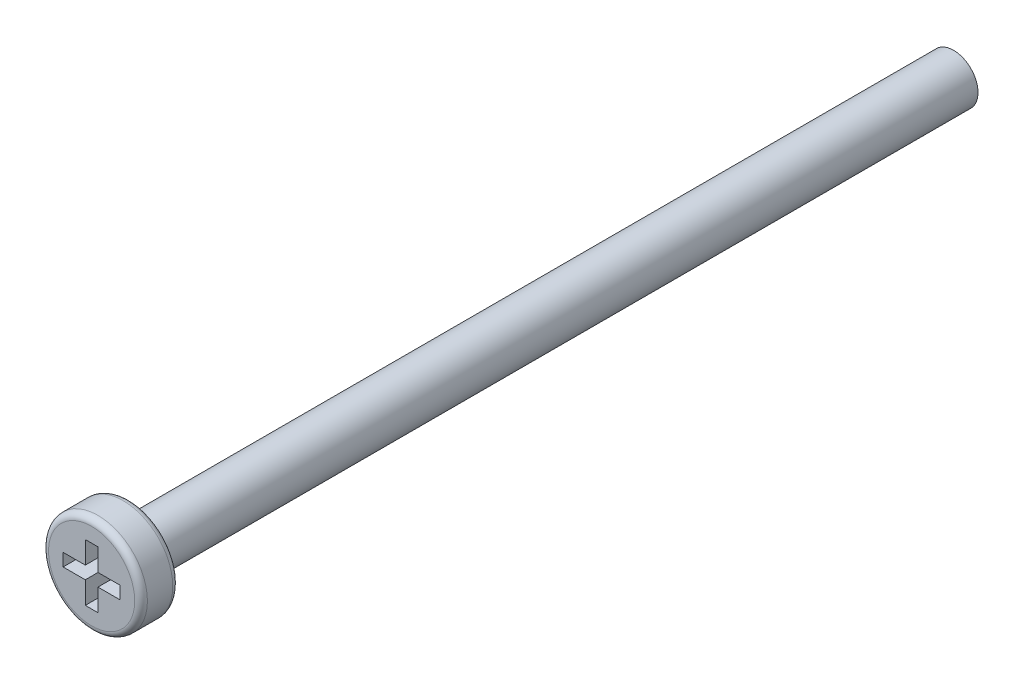
ISO-10303-21;
HEADER;
FILE_DESCRIPTION(('STEP AP214'),'2;1');
FILE_NAME('part.step','',(''),(''),'','','');
FILE_SCHEMA(('AUTOMOTIVE_DESIGN { 1 0 10303 214 1 1 1 1 }'));
ENDSEC;
DATA;
#1=APPLICATION_CONTEXT('core data for automotive mechanical design processes');
#2=APPLICATION_PROTOCOL_DEFINITION('international standard','automotive_design',2000,#1);
#3=PRODUCT_CONTEXT('',#1,'mechanical');
#4=PRODUCT('Part','Part','',(#3));
#5=PRODUCT_RELATED_PRODUCT_CATEGORY('part','',(#4));
#6=PRODUCT_DEFINITION_FORMATION('','',#4);
#7=PRODUCT_DEFINITION_CONTEXT('part definition',#1,'design');
#8=PRODUCT_DEFINITION('design','',#6,#7);
#9=PRODUCT_DEFINITION_SHAPE('','',#8);
#10=(LENGTH_UNIT() NAMED_UNIT(*) SI_UNIT(.MILLI.,.METRE.));
#11=(NAMED_UNIT(*) PLANE_ANGLE_UNIT() SI_UNIT($,.RADIAN.));
#12=(NAMED_UNIT(*) SI_UNIT($,.STERADIAN.) SOLID_ANGLE_UNIT());
#13=UNCERTAINTY_MEASURE_WITH_UNIT(LENGTH_MEASURE(1.E-05),#10,'distance_accuracy_value','');
#14=(GEOMETRIC_REPRESENTATION_CONTEXT(3) GLOBAL_UNCERTAINTY_ASSIGNED_CONTEXT((#13)) GLOBAL_UNIT_ASSIGNED_CONTEXT((#10,
#11,#12)) REPRESENTATION_CONTEXT('',''));
#15=CARTESIAN_POINT('',(0.,0.,0.));
#16=DIRECTION('',(0.,0.,1.));
#17=DIRECTION('',(1.,0.,0.));
#18=AXIS2_PLACEMENT_3D('',#15,#16,#17);
#19=CARTESIAN_POINT('',(0.,0.,0.));
#20=DIRECTION('',(0.,0.,1.));
#21=DIRECTION('',(1.,0.,0.));
#22=AXIS2_PLACEMENT_3D('',#19,#20,#21);
#23=PLANE('',#22);
#24=CARTESIAN_POINT('',(0.,0.,0.));
#25=DIRECTION('',(0.,0.,1.));
#26=DIRECTION('',(1.,0.,0.));
#27=AXIS2_PLACEMENT_3D('',#24,#25,#26);
#28=CIRCLE('',#27,3.4);
#29=CARTESIAN_POINT('',(3.4,0.,0.));
#30=VERTEX_POINT('',#29);
#31=EDGE_CURVE('E216',#30,#30,#28,.F.);
#32=ORIENTED_EDGE('',*,*,#31,.T.);
#33=EDGE_LOOP('',(#32));
#34=FACE_BOUND('',#33,.T.);
#35=CARTESIAN_POINT('',(0.,0.,0.));
#36=DIRECTION('',(0.,0.,1.));
#37=DIRECTION('',(1.,0.,0.));
#38=AXIS2_PLACEMENT_3D('',#35,#36,#37);
#39=CIRCLE('',#38,1.925);
#40=CARTESIAN_POINT('',(1.925,0.,0.));
#41=VERTEX_POINT('',#40);
#42=EDGE_CURVE('E11',#41,#41,#39,.F.);
#43=ORIENTED_EDGE('',*,*,#42,.F.);
#44=EDGE_LOOP('',(#43));
#45=FACE_BOUND('',#44,.T.);
#46=ADVANCED_FACE('F36',(#34,#45),#23,.F.);
#47=CARTESIAN_POINT('',(0.,0.,3.));
#48=DIRECTION('',(0.,0.,-1.));
#49=DIRECTION('',(-1.,0.,0.));
#50=AXIS2_PLACEMENT_3D('',#47,#48,#49);
#51=CYLINDRICAL_SURFACE('',#50,3.9);
#52=CARTESIAN_POINT('',(0.,0.,0.5));
#53=DIRECTION('',(0.,0.,1.));
#54=DIRECTION('',(1.,0.,0.));
#55=AXIS2_PLACEMENT_3D('',#52,#53,#54);
#56=CIRCLE('',#55,3.9);
#57=CARTESIAN_POINT('',(3.9,0.,0.5));
#58=VERTEX_POINT('',#57);
#59=EDGE_CURVE('E213',#58,#58,#56,.T.);
#60=ORIENTED_EDGE('',*,*,#59,.T.);
#61=EDGE_LOOP('',(#60));
#62=FACE_BOUND('',#61,.T.);
#63=CARTESIAN_POINT('',(0.,0.,2.5));
#64=DIRECTION('',(0.,0.,1.));
#65=DIRECTION('',(1.,0.,0.));
#66=AXIS2_PLACEMENT_3D('',#63,#64,#65);
#67=CIRCLE('',#66,3.9);
#68=CARTESIAN_POINT('',(3.9,0.,2.5));
#69=VERTEX_POINT('',#68);
#70=EDGE_CURVE('E193',#69,#69,#67,.F.);
#71=ORIENTED_EDGE('',*,*,#70,.T.);
#72=EDGE_LOOP('',(#71));
#73=FACE_BOUND('',#72,.T.);
#74=ADVANCED_FACE('F238',(#62,#73),#51,.T.);
#75=CARTESIAN_POINT('',(0.,0.,3.));
#76=DIRECTION('',(0.,0.,1.));
#77=DIRECTION('',(1.,0.,0.));
#78=AXIS2_PLACEMENT_3D('',#75,#76,#77);
#79=PLANE('',#78);
#80=CARTESIAN_POINT('',(0.,0.,3.));
#81=DIRECTION('',(0.,0.,1.));
#82=DIRECTION('',(1.,0.,0.));
#83=AXIS2_PLACEMENT_3D('',#80,#81,#82);
#84=CIRCLE('',#83,3.4);
#85=CARTESIAN_POINT('',(3.4,0.,3.));
#86=VERTEX_POINT('',#85);
#87=EDGE_CURVE('E44',#86,#86,#84,.T.);
#88=ORIENTED_EDGE('',*,*,#87,.T.);
#89=EDGE_LOOP('',(#88));
#90=FACE_BOUND('',#89,.T.);
#91=DIRECTION('',(0.,-1.,0.));
#92=VECTOR('',#91,1.);
#93=CARTESIAN_POINT('',(-0.5,-0.5,3.));
#94=LINE('',#93,#92);
#95=CARTESIAN_POINT('',(-0.5,-0.5,3.));
#96=VERTEX_POINT('',#95);
#97=CARTESIAN_POINT('',(-0.5,-2.25,3.));
#98=VERTEX_POINT('',#97);
#99=EDGE_CURVE('E51',#96,#98,#94,.T.);
#100=ORIENTED_EDGE('',*,*,#99,.F.);
#101=DIRECTION('',(1.,0.,0.));
#102=VECTOR('',#101,1.);
#103=CARTESIAN_POINT('',(-0.5,-0.5,3.));
#104=LINE('',#103,#102);
#105=CARTESIAN_POINT('',(-2.25,-0.5,3.));
#106=VERTEX_POINT('',#105);
#107=EDGE_CURVE('E189',#106,#96,#104,.T.);
#108=ORIENTED_EDGE('',*,*,#107,.F.);
#109=DIRECTION('',(0.,-1.,0.));
#110=VECTOR('',#109,1.);
#111=CARTESIAN_POINT('',(-2.25,0.5,3.));
#112=LINE('',#111,#110);
#113=CARTESIAN_POINT('',(-2.25,0.5,3.));
#114=VERTEX_POINT('',#113);
#115=EDGE_CURVE('E187',#114,#106,#112,.T.);
#116=ORIENTED_EDGE('',*,*,#115,.F.);
#117=DIRECTION('',(-1.,0.,0.));
#118=VECTOR('',#117,1.);
#119=CARTESIAN_POINT('',(-0.5,0.5,3.));
#120=LINE('',#119,#118);
#121=CARTESIAN_POINT('',(-0.5,0.5,3.));
#122=VERTEX_POINT('',#121);
#123=EDGE_CURVE('E135',#122,#114,#120,.T.);
#124=ORIENTED_EDGE('',*,*,#123,.F.);
#125=DIRECTION('',(0.,-1.,0.));
#126=VECTOR('',#125,1.);
#127=CARTESIAN_POINT('',(-0.5,2.25,3.));
#128=LINE('',#127,#126);
#129=CARTESIAN_POINT('',(-0.5,2.25,3.));
#130=VERTEX_POINT('',#129);
#131=EDGE_CURVE('E183',#130,#122,#128,.T.);
#132=ORIENTED_EDGE('',*,*,#131,.F.);
#133=DIRECTION('',(-1.,0.,0.));
#134=VECTOR('',#133,1.);
#135=CARTESIAN_POINT('',(0.5,2.25,3.));
#136=LINE('',#135,#134);
#137=CARTESIAN_POINT('',(0.5,2.25,3.));
#138=VERTEX_POINT('',#137);
#139=EDGE_CURVE('E180',#138,#130,#136,.T.);
#140=ORIENTED_EDGE('',*,*,#139,.F.);
#141=DIRECTION('',(0.,1.,0.));
#142=VECTOR('',#141,1.);
#143=CARTESIAN_POINT('',(0.5,2.25,3.));
#144=LINE('',#143,#142);
#145=CARTESIAN_POINT('',(0.5,0.5,3.));
#146=VERTEX_POINT('',#145);
#147=EDGE_CURVE('E177',#146,#138,#144,.T.);
#148=ORIENTED_EDGE('',*,*,#147,.F.);
#149=DIRECTION('',(-1.,0.,0.));
#150=VECTOR('',#149,1.);
#151=CARTESIAN_POINT('',(2.25,0.5,3.));
#152=LINE('',#151,#150);
#153=CARTESIAN_POINT('',(2.25,0.5,3.));
#154=VERTEX_POINT('',#153);
#155=EDGE_CURVE('E174',#154,#146,#152,.T.);
#156=ORIENTED_EDGE('',*,*,#155,.F.);
#157=DIRECTION('',(0.,1.,0.));
#158=VECTOR('',#157,1.);
#159=CARTESIAN_POINT('',(2.25,0.5,3.));
#160=LINE('',#159,#158);
#161=CARTESIAN_POINT('',(2.25,-0.5,3.));
#162=VERTEX_POINT('',#161);
#163=EDGE_CURVE('E171',#162,#154,#160,.T.);
#164=ORIENTED_EDGE('',*,*,#163,.F.);
#165=DIRECTION('',(1.,0.,0.));
#166=VECTOR('',#165,1.);
#167=CARTESIAN_POINT('',(2.25,-0.5,3.));
#168=LINE('',#167,#166);
#169=CARTESIAN_POINT('',(0.5,-0.5,3.));
#170=VERTEX_POINT('',#169);
#171=EDGE_CURVE('E168',#170,#162,#168,.T.);
#172=ORIENTED_EDGE('',*,*,#171,.F.);
#173=DIRECTION('',(0.,1.,0.));
#174=VECTOR('',#173,1.);
#175=CARTESIAN_POINT('',(0.5,-0.5,3.));
#176=LINE('',#175,#174);
#177=CARTESIAN_POINT('',(0.500000000000001,-2.25,3.));
#178=VERTEX_POINT('',#177);
#179=EDGE_CURVE('E165',#178,#170,#176,.T.);
#180=ORIENTED_EDGE('',*,*,#179,.F.);
#181=DIRECTION('',(1.,0.,0.));
#182=VECTOR('',#181,1.);
#183=CARTESIAN_POINT('',(0.500000000000001,-2.25,3.));
#184=LINE('',#183,#182);
#185=EDGE_CURVE('E161',#98,#178,#184,.T.);
#186=ORIENTED_EDGE('',*,*,#185,.F.);
#187=EDGE_LOOP('',(#100,#108,#116,#124,#132,#140,#148,#156,#164,#172,#180,#186));
#188=FACE_BOUND('',#187,.T.);
#189=ADVANCED_FACE('F221',(#90,#188),#79,.T.);
#190=CARTESIAN_POINT('',(-0.5,-0.5,1.));
#191=DIRECTION('',(-1.,0.,0.));
#192=DIRECTION('',(0.,-1.,0.));
#193=AXIS2_PLACEMENT_3D('',#190,#191,#192);
#194=PLANE('',#193);
#195=ORIENTED_EDGE('',*,*,#99,.T.);
#196=DIRECTION('',(0.,0.,1.));
#197=VECTOR('',#196,1.);
#198=CARTESIAN_POINT('',(-0.5,-2.25,1.));
#199=LINE('',#198,#197);
#200=CARTESIAN_POINT('',(-0.5,-2.25,1.));
#201=VERTEX_POINT('',#200);
#202=EDGE_CURVE('E99',#201,#98,#199,.T.);
#203=ORIENTED_EDGE('',*,*,#202,.F.);
#204=DIRECTION('',(0.,-1.,0.));
#205=VECTOR('',#204,1.);
#206=CARTESIAN_POINT('',(-0.5,-0.5,1.));
#207=LINE('',#206,#205);
#208=CARTESIAN_POINT('',(-0.5,-0.5,1.));
#209=VERTEX_POINT('',#208);
#210=EDGE_CURVE('E191',#209,#201,#207,.T.);
#211=ORIENTED_EDGE('',*,*,#210,.F.);
#212=DIRECTION('',(0.,0.,1.));
#213=VECTOR('',#212,1.);
#214=CARTESIAN_POINT('',(-0.5,-0.5,1.));
#215=LINE('',#214,#213);
#216=EDGE_CURVE('E59',#209,#96,#215,.T.);
#217=ORIENTED_EDGE('',*,*,#216,.T.);
#218=EDGE_LOOP('',(#195,#203,#211,#217));
#219=FACE_BOUND('',#218,.T.);
#220=ADVANCED_FACE('F250',(#219),#194,.F.);
#221=CARTESIAN_POINT('',(-0.5,-0.5,1.));
#222=DIRECTION('',(0.,-1.,0.));
#223=DIRECTION('',(1.,0.,0.));
#224=AXIS2_PLACEMENT_3D('',#221,#222,#223);
#225=PLANE('',#224);
#226=ORIENTED_EDGE('',*,*,#107,.T.);
#227=ORIENTED_EDGE('',*,*,#216,.F.);
#228=DIRECTION('',(1.,0.,0.));
#229=VECTOR('',#228,1.);
#230=CARTESIAN_POINT('',(-0.5,-0.5,1.));
#231=LINE('',#230,#229);
#232=CARTESIAN_POINT('',(-2.25,-0.5,1.));
#233=VERTEX_POINT('',#232);
#234=EDGE_CURVE('E147',#233,#209,#231,.T.);
#235=ORIENTED_EDGE('',*,*,#234,.F.);
#236=DIRECTION('',(0.,0.,1.));
#237=VECTOR('',#236,1.);
#238=CARTESIAN_POINT('',(-2.25,-0.5,1.));
#239=LINE('',#238,#237);
#240=EDGE_CURVE('E139',#233,#106,#239,.T.);
#241=ORIENTED_EDGE('',*,*,#240,.T.);
#242=EDGE_LOOP('',(#226,#227,#235,#241));
#243=FACE_BOUND('',#242,.T.);
#244=ADVANCED_FACE('F253',(#243),#225,.F.);
#245=CARTESIAN_POINT('',(-2.25,0.5,1.));
#246=DIRECTION('',(-1.,0.,0.));
#247=DIRECTION('',(0.,-1.,0.));
#248=AXIS2_PLACEMENT_3D('',#245,#246,#247);
#249=PLANE('',#248);
#250=ORIENTED_EDGE('',*,*,#115,.T.);
#251=ORIENTED_EDGE('',*,*,#240,.F.);
#252=DIRECTION('',(0.,-1.,0.));
#253=VECTOR('',#252,1.);
#254=CARTESIAN_POINT('',(-2.25,0.5,1.));
#255=LINE('',#254,#253);
#256=CARTESIAN_POINT('',(-2.25,0.5,1.));
#257=VERTEX_POINT('',#256);
#258=EDGE_CURVE('E143',#257,#233,#255,.T.);
#259=ORIENTED_EDGE('',*,*,#258,.F.);
#260=DIRECTION('',(0.,0.,1.));
#261=VECTOR('',#260,1.);
#262=CARTESIAN_POINT('',(-2.25,0.5,1.));
#263=LINE('',#262,#261);
#264=EDGE_CURVE('E128',#257,#114,#263,.T.);
#265=ORIENTED_EDGE('',*,*,#264,.T.);
#266=EDGE_LOOP('',(#250,#251,#259,#265));
#267=FACE_BOUND('',#266,.T.);
#268=ADVANCED_FACE('F144',(#267),#249,.F.);
#269=CARTESIAN_POINT('',(-0.5,0.5,1.));
#270=DIRECTION('',(0.,1.,0.));
#271=DIRECTION('',(-1.,0.,0.));
#272=AXIS2_PLACEMENT_3D('',#269,#270,#271);
#273=PLANE('',#272);
#274=ORIENTED_EDGE('',*,*,#123,.T.);
#275=ORIENTED_EDGE('',*,*,#264,.F.);
#276=DIRECTION('',(-1.,0.,0.));
#277=VECTOR('',#276,1.);
#278=CARTESIAN_POINT('',(-0.5,0.5,1.));
#279=LINE('',#278,#277);
#280=CARTESIAN_POINT('',(-0.5,0.5,1.));
#281=VERTEX_POINT('',#280);
#282=EDGE_CURVE('E132',#281,#257,#279,.T.);
#283=ORIENTED_EDGE('',*,*,#282,.F.);
#284=DIRECTION('',(0.,0.,1.));
#285=VECTOR('',#284,1.);
#286=CARTESIAN_POINT('',(-0.5,0.5,1.));
#287=LINE('',#286,#285);
#288=EDGE_CURVE('E140',#281,#122,#287,.T.);
#289=ORIENTED_EDGE('',*,*,#288,.T.);
#290=EDGE_LOOP('',(#274,#275,#283,#289));
#291=FACE_BOUND('',#290,.T.);
#292=ADVANCED_FACE('F130',(#291),#273,.F.);
#293=CARTESIAN_POINT('',(-0.5,2.25,1.));
#294=DIRECTION('',(-1.,0.,0.));
#295=DIRECTION('',(0.,-1.,0.));
#296=AXIS2_PLACEMENT_3D('',#293,#294,#295);
#297=PLANE('',#296);
#298=ORIENTED_EDGE('',*,*,#131,.T.);
#299=ORIENTED_EDGE('',*,*,#288,.F.);
#300=DIRECTION('',(0.,-1.,0.));
#301=VECTOR('',#300,1.);
#302=CARTESIAN_POINT('',(-0.5,2.25,1.));
#303=LINE('',#302,#301);
#304=CARTESIAN_POINT('',(-0.5,2.25,1.));
#305=VERTEX_POINT('',#304);
#306=EDGE_CURVE('E153',#305,#281,#303,.T.);
#307=ORIENTED_EDGE('',*,*,#306,.F.);
#308=DIRECTION('',(0.,0.,1.));
#309=VECTOR('',#308,1.);
#310=CARTESIAN_POINT('',(-0.5,2.25,1.));
#311=LINE('',#310,#309);
#312=EDGE_CURVE('E196',#305,#130,#311,.T.);
#313=ORIENTED_EDGE('',*,*,#312,.T.);
#314=EDGE_LOOP('',(#298,#299,#307,#313));
#315=FACE_BOUND('',#314,.T.);
#316=ADVANCED_FACE('F281',(#315),#297,.F.);
#317=CARTESIAN_POINT('',(0.5,2.25,1.));
#318=DIRECTION('',(0.,1.,0.));
#319=DIRECTION('',(-1.,0.,0.));
#320=AXIS2_PLACEMENT_3D('',#317,#318,#319);
#321=PLANE('',#320);
#322=ORIENTED_EDGE('',*,*,#139,.T.);
#323=ORIENTED_EDGE('',*,*,#312,.F.);
#324=DIRECTION('',(-1.,0.,0.));
#325=VECTOR('',#324,1.);
#326=CARTESIAN_POINT('',(0.5,2.25,1.));
#327=LINE('',#326,#325);
#328=CARTESIAN_POINT('',(0.5,2.25,1.));
#329=VERTEX_POINT('',#328);
#330=EDGE_CURVE('E155',#329,#305,#327,.T.);
#331=ORIENTED_EDGE('',*,*,#330,.F.);
#332=DIRECTION('',(0.,0.,1.));
#333=VECTOR('',#332,1.);
#334=CARTESIAN_POINT('',(0.5,2.25,1.));
#335=LINE('',#334,#333);
#336=EDGE_CURVE('E198',#329,#138,#335,.T.);
#337=ORIENTED_EDGE('',*,*,#336,.T.);
#338=EDGE_LOOP('',(#322,#323,#331,#337));
#339=FACE_BOUND('',#338,.T.);
#340=ADVANCED_FACE('F277',(#339),#321,.F.);
#341=CARTESIAN_POINT('',(0.5,2.25,1.));
#342=DIRECTION('',(1.,0.,0.));
#343=DIRECTION('',(0.,1.,0.));
#344=AXIS2_PLACEMENT_3D('',#341,#342,#343);
#345=PLANE('',#344);
#346=ORIENTED_EDGE('',*,*,#147,.T.);
#347=ORIENTED_EDGE('',*,*,#336,.F.);
#348=DIRECTION('',(0.,1.,0.));
#349=VECTOR('',#348,1.);
#350=CARTESIAN_POINT('',(0.5,2.25,1.));
#351=LINE('',#350,#349);
#352=CARTESIAN_POINT('',(0.5,0.5,1.));
#353=VERTEX_POINT('',#352);
#354=EDGE_CURVE('E318',#353,#329,#351,.T.);
#355=ORIENTED_EDGE('',*,*,#354,.F.);
#356=DIRECTION('',(0.,0.,1.));
#357=VECTOR('',#356,1.);
#358=CARTESIAN_POINT('',(0.5,0.5,1.));
#359=LINE('',#358,#357);
#360=EDGE_CURVE('E200',#353,#146,#359,.T.);
#361=ORIENTED_EDGE('',*,*,#360,.T.);
#362=EDGE_LOOP('',(#346,#347,#355,#361));
#363=FACE_BOUND('',#362,.T.);
#364=ADVANCED_FACE('F273',(#363),#345,.F.);
#365=CARTESIAN_POINT('',(2.25,0.5,1.));
#366=DIRECTION('',(0.,1.,0.));
#367=DIRECTION('',(-1.,0.,0.));
#368=AXIS2_PLACEMENT_3D('',#365,#366,#367);
#369=PLANE('',#368);
#370=ORIENTED_EDGE('',*,*,#155,.T.);
#371=ORIENTED_EDGE('',*,*,#360,.F.);
#372=DIRECTION('',(-1.,0.,0.));
#373=VECTOR('',#372,1.);
#374=CARTESIAN_POINT('',(2.25,0.5,1.));
#375=LINE('',#374,#373);
#376=CARTESIAN_POINT('',(2.25,0.5,1.));
#377=VERTEX_POINT('',#376);
#378=EDGE_CURVE('E315',#377,#353,#375,.T.);
#379=ORIENTED_EDGE('',*,*,#378,.F.);
#380=DIRECTION('',(0.,0.,1.));
#381=VECTOR('',#380,1.);
#382=CARTESIAN_POINT('',(2.25,0.5,1.));
#383=LINE('',#382,#381);
#384=EDGE_CURVE('E202',#377,#154,#383,.T.);
#385=ORIENTED_EDGE('',*,*,#384,.T.);
#386=EDGE_LOOP('',(#370,#371,#379,#385));
#387=FACE_BOUND('',#386,.T.);
#388=ADVANCED_FACE('F269',(#387),#369,.F.);
#389=CARTESIAN_POINT('',(2.25,0.5,1.));
#390=DIRECTION('',(1.,0.,0.));
#391=DIRECTION('',(0.,0.,-1.));
#392=AXIS2_PLACEMENT_3D('',#389,#390,#391);
#393=PLANE('',#392);
#394=ORIENTED_EDGE('',*,*,#163,.T.);
#395=ORIENTED_EDGE('',*,*,#384,.F.);
#396=DIRECTION('',(0.,1.,0.));
#397=VECTOR('',#396,1.);
#398=CARTESIAN_POINT('',(2.25,0.5,1.));
#399=LINE('',#398,#397);
#400=CARTESIAN_POINT('',(2.25,-0.5,1.));
#401=VERTEX_POINT('',#400);
#402=EDGE_CURVE('E312',#401,#377,#399,.T.);
#403=ORIENTED_EDGE('',*,*,#402,.F.);
#404=DIRECTION('',(0.,0.,1.));
#405=VECTOR('',#404,1.);
#406=CARTESIAN_POINT('',(2.25,-0.5,1.));
#407=LINE('',#406,#405);
#408=EDGE_CURVE('E204',#401,#162,#407,.T.);
#409=ORIENTED_EDGE('',*,*,#408,.T.);
#410=EDGE_LOOP('',(#394,#395,#403,#409));
#411=FACE_BOUND('',#410,.T.);
#412=ADVANCED_FACE('F265',(#411),#393,.F.);
#413=CARTESIAN_POINT('',(2.25,-0.5,1.));
#414=DIRECTION('',(0.,-1.,0.));
#415=DIRECTION('',(1.,0.,0.));
#416=AXIS2_PLACEMENT_3D('',#413,#414,#415);
#417=PLANE('',#416);
#418=ORIENTED_EDGE('',*,*,#171,.T.);
#419=ORIENTED_EDGE('',*,*,#408,.F.);
#420=DIRECTION('',(1.,0.,0.));
#421=VECTOR('',#420,1.);
#422=CARTESIAN_POINT('',(2.25,-0.5,1.));
#423=LINE('',#422,#421);
#424=CARTESIAN_POINT('',(0.5,-0.5,1.));
#425=VERTEX_POINT('',#424);
#426=EDGE_CURVE('E309',#425,#401,#423,.T.);
#427=ORIENTED_EDGE('',*,*,#426,.F.);
#428=DIRECTION('',(0.,0.,1.));
#429=VECTOR('',#428,1.);
#430=CARTESIAN_POINT('',(0.5,-0.5,1.));
#431=LINE('',#430,#429);
#432=EDGE_CURVE('E206',#425,#170,#431,.T.);
#433=ORIENTED_EDGE('',*,*,#432,.T.);
#434=EDGE_LOOP('',(#418,#419,#427,#433));
#435=FACE_BOUND('',#434,.T.);
#436=ADVANCED_FACE('F261',(#435),#417,.F.);
#437=CARTESIAN_POINT('',(0.5,-0.5,1.));
#438=DIRECTION('',(1.,0.,0.));
#439=DIRECTION('',(0.,1.,0.));
#440=AXIS2_PLACEMENT_3D('',#437,#438,#439);
#441=PLANE('',#440);
#442=ORIENTED_EDGE('',*,*,#179,.T.);
#443=ORIENTED_EDGE('',*,*,#432,.F.);
#444=DIRECTION('',(0.,1.,0.));
#445=VECTOR('',#444,1.);
#446=CARTESIAN_POINT('',(0.5,-0.5,1.));
#447=LINE('',#446,#445);
#448=CARTESIAN_POINT('',(0.500000000000001,-2.25,1.));
#449=VERTEX_POINT('',#448);
#450=EDGE_CURVE('E306',#449,#425,#447,.T.);
#451=ORIENTED_EDGE('',*,*,#450,.F.);
#452=DIRECTION('',(0.,0.,1.));
#453=VECTOR('',#452,1.);
#454=CARTESIAN_POINT('',(0.500000000000001,-2.25,1.));
#455=LINE('',#454,#453);
#456=EDGE_CURVE('E208',#449,#178,#455,.T.);
#457=ORIENTED_EDGE('',*,*,#456,.T.);
#458=EDGE_LOOP('',(#442,#443,#451,#457));
#459=FACE_BOUND('',#458,.T.);
#460=ADVANCED_FACE('F257',(#459),#441,.F.);
#461=CARTESIAN_POINT('',(0.500000000000001,-2.25,1.));
#462=DIRECTION('',(0.,-1.,0.));
#463=DIRECTION('',(1.,0.,0.));
#464=AXIS2_PLACEMENT_3D('',#461,#462,#463);
#465=PLANE('',#464);
#466=ORIENTED_EDGE('',*,*,#185,.T.);
#467=ORIENTED_EDGE('',*,*,#456,.F.);
#468=DIRECTION('',(1.,0.,0.));
#469=VECTOR('',#468,1.);
#470=CARTESIAN_POINT('',(0.500000000000001,-2.25,1.));
#471=LINE('',#470,#469);
#472=EDGE_CURVE('E303',#201,#449,#471,.T.);
#473=ORIENTED_EDGE('',*,*,#472,.F.);
#474=ORIENTED_EDGE('',*,*,#202,.T.);
#475=EDGE_LOOP('',(#466,#467,#473,#474));
#476=FACE_BOUND('',#475,.T.);
#477=ADVANCED_FACE('F254',(#476),#465,.F.);
#478=CARTESIAN_POINT('',(0.,0.,1.));
#479=DIRECTION('',(0.,0.,-1.));
#480=DIRECTION('',(-1.,0.,0.));
#481=AXIS2_PLACEMENT_3D('',#478,#479,#480);
#482=PLANE('',#481);
#483=ORIENTED_EDGE('',*,*,#210,.T.);
#484=ORIENTED_EDGE('',*,*,#472,.T.);
#485=ORIENTED_EDGE('',*,*,#450,.T.);
#486=ORIENTED_EDGE('',*,*,#426,.T.);
#487=ORIENTED_EDGE('',*,*,#402,.T.);
#488=ORIENTED_EDGE('',*,*,#378,.T.);
#489=ORIENTED_EDGE('',*,*,#354,.T.);
#490=ORIENTED_EDGE('',*,*,#330,.T.);
#491=ORIENTED_EDGE('',*,*,#306,.T.);
#492=ORIENTED_EDGE('',*,*,#282,.T.);
#493=ORIENTED_EDGE('',*,*,#258,.T.);
#494=ORIENTED_EDGE('',*,*,#234,.T.);
#495=EDGE_LOOP('',(#483,#484,#485,#486,#487,#488,#489,#490,#491,#492,#493,#494));
#496=FACE_BOUND('',#495,.T.);
#497=ADVANCED_FACE('F150',(#496),#482,.F.);
#498=CARTESIAN_POINT('',(0.,0.,0.5));
#499=DIRECTION('',(0.,0.,1.));
#500=DIRECTION('',(1.,0.,0.));
#501=AXIS2_PLACEMENT_3D('',#498,#499,#500);
#502=TOROIDAL_SURFACE('',#501,3.4,0.5);
#503=ORIENTED_EDGE('',*,*,#31,.F.);
#504=EDGE_LOOP('',(#503));
#505=FACE_BOUND('',#504,.T.);
#506=ORIENTED_EDGE('',*,*,#59,.F.);
#507=EDGE_LOOP('',(#506));
#508=FACE_BOUND('',#507,.T.);
#509=ADVANCED_FACE('F226',(#505,#508),#502,.T.);
#510=CARTESIAN_POINT('',(0.,0.,2.5));
#511=DIRECTION('',(0.,0.,1.));
#512=DIRECTION('',(1.,0.,0.));
#513=AXIS2_PLACEMENT_3D('',#510,#511,#512);
#514=TOROIDAL_SURFACE('',#513,3.4,0.5);
#515=ORIENTED_EDGE('',*,*,#70,.F.);
#516=EDGE_LOOP('',(#515));
#517=FACE_BOUND('',#516,.T.);
#518=ORIENTED_EDGE('',*,*,#87,.F.);
#519=EDGE_LOOP('',(#518));
#520=FACE_BOUND('',#519,.T.);
#521=ADVANCED_FACE('F38',(#517,#520),#514,.T.);
#522=CARTESIAN_POINT('',(0.,0.,-65.));
#523=DIRECTION('',(0.,0.,1.));
#524=DIRECTION('',(1.,0.,0.));
#525=AXIS2_PLACEMENT_3D('',#522,#523,#524);
#526=CYLINDRICAL_SURFACE('',#525,1.925);
#527=CARTESIAN_POINT('',(0.,0.,-65.));
#528=DIRECTION('',(0.,0.,-1.));
#529=DIRECTION('',(-1.,0.,0.));
#530=AXIS2_PLACEMENT_3D('',#527,#528,#529);
#531=CIRCLE('',#530,1.925);
#532=CARTESIAN_POINT('',(-1.925,0.,-65.));
#533=VERTEX_POINT('',#532);
#534=EDGE_CURVE('E162',#533,#533,#531,.T.);
#535=ORIENTED_EDGE('',*,*,#534,.F.);
#536=EDGE_LOOP('',(#535));
#537=FACE_BOUND('',#536,.T.);
#538=ORIENTED_EDGE('',*,*,#42,.T.);
#539=EDGE_LOOP('',(#538));
#540=FACE_BOUND('',#539,.T.);
#541=ADVANCED_FACE('F225',(#537,#540),#526,.T.);
#542=CARTESIAN_POINT('',(0.,0.,-65.));
#543=DIRECTION('',(0.,0.,-1.));
#544=DIRECTION('',(-1.,0.,0.));
#545=AXIS2_PLACEMENT_3D('',#542,#543,#544);
#546=PLANE('',#545);
#547=ORIENTED_EDGE('',*,*,#534,.T.);
#548=EDGE_LOOP('',(#547));
#549=FACE_BOUND('',#548,.T.);
#550=ADVANCED_FACE('F232',(#549),#546,.T.);
#551=CLOSED_SHELL('',(#46,#74,#189,#220,#244,#268,#292,#316,#340,#364,#388,#412,#436,#460,#477,
#497,#509,#521,#541,#550));
#552=MANIFOLD_SOLID_BREP('B2',#551);
#553=ADVANCED_BREP_SHAPE_REPRESENTATION('',(#18,#552),#14);
#554=SHAPE_DEFINITION_REPRESENTATION(#9,#553);
ENDSEC;
END-ISO-10303-21;
